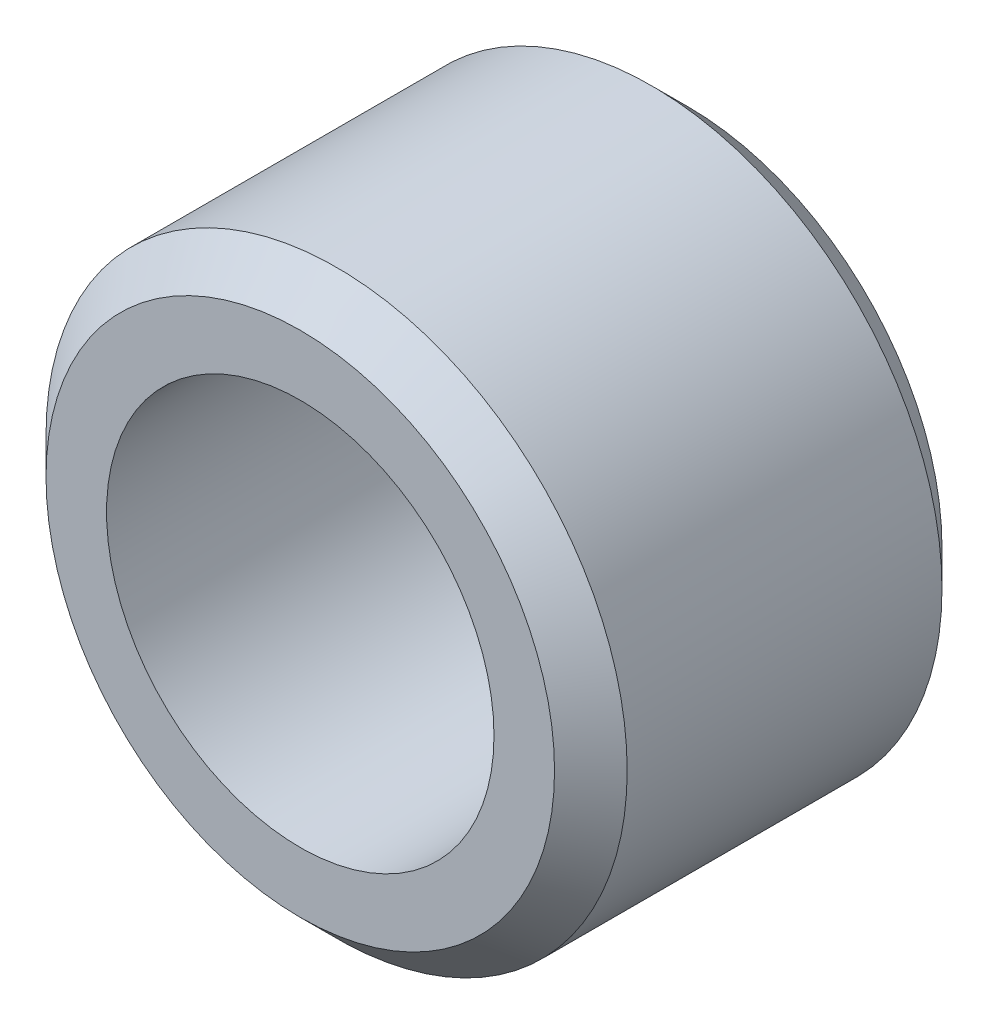
ISO-10303-21;
HEADER;
FILE_DESCRIPTION(('STEP AP214'),'2;1');
FILE_NAME('part.step','',(''),(''),'','','');
FILE_SCHEMA(('AUTOMOTIVE_DESIGN { 1 0 10303 214 1 1 1 1 }'));
ENDSEC;
DATA;
#1=APPLICATION_CONTEXT('core data for automotive mechanical design processes');
#2=APPLICATION_PROTOCOL_DEFINITION('international standard','automotive_design',2000,#1);
#3=PRODUCT_CONTEXT('',#1,'mechanical');
#4=PRODUCT('Part','Part','',(#3));
#5=PRODUCT_RELATED_PRODUCT_CATEGORY('part','',(#4));
#6=PRODUCT_DEFINITION_FORMATION('','',#4);
#7=PRODUCT_DEFINITION_CONTEXT('part definition',#1,'design');
#8=PRODUCT_DEFINITION('design','',#6,#7);
#9=PRODUCT_DEFINITION_SHAPE('','',#8);
#10=(LENGTH_UNIT() NAMED_UNIT(*) SI_UNIT(.MILLI.,.METRE.));
#11=(NAMED_UNIT(*) PLANE_ANGLE_UNIT() SI_UNIT($,.RADIAN.));
#12=(NAMED_UNIT(*) SI_UNIT($,.STERADIAN.) SOLID_ANGLE_UNIT());
#13=UNCERTAINTY_MEASURE_WITH_UNIT(LENGTH_MEASURE(1.E-05),#10,'distance_accuracy_value','');
#14=(GEOMETRIC_REPRESENTATION_CONTEXT(3) GLOBAL_UNCERTAINTY_ASSIGNED_CONTEXT((#13)) GLOBAL_UNIT_ASSIGNED_CONTEXT((#10,
#11,#12)) REPRESENTATION_CONTEXT('',''));
#15=CARTESIAN_POINT('',(0.,0.,0.));
#16=DIRECTION('',(0.,0.,1.));
#17=DIRECTION('',(1.,0.,0.));
#18=AXIS2_PLACEMENT_3D('',#15,#16,#17);
#19=CARTESIAN_POINT('',(0.,4.7625,3.175));
#20=DIRECTION('',(0.,0.,-1.));
#21=DIRECTION('',(-1.,0.,0.));
#22=AXIS2_PLACEMENT_3D('',#19,#20,#21);
#23=PLANE('',#22);
#24=CARTESIAN_POINT('',(0.,0.,3.175));
#25=DIRECTION('',(0.,0.,-1.));
#26=DIRECTION('',(-1.,0.,0.));
#27=AXIS2_PLACEMENT_3D('',#24,#25,#26);
#28=CIRCLE('',#27,4.1671875);
#29=CARTESIAN_POINT('',(-4.1671875,0.,3.175));
#30=VERTEX_POINT('',#29);
#31=EDGE_CURVE('E10',#30,#30,#28,.F.);
#32=ORIENTED_EDGE('',*,*,#31,.T.);
#33=EDGE_LOOP('',(#32));
#34=FACE_BOUND('',#33,.T.);
#35=CARTESIAN_POINT('',(0.,0.,3.175));
#36=DIRECTION('',(0.,0.,1.));
#37=DIRECTION('',(1.,0.,0.));
#38=AXIS2_PLACEMENT_3D('',#35,#36,#37);
#39=CIRCLE('',#38,3.175);
#40=CARTESIAN_POINT('',(3.175,0.,3.175));
#41=VERTEX_POINT('',#40);
#42=EDGE_CURVE('E52',#41,#41,#39,.T.);
#43=ORIENTED_EDGE('',*,*,#42,.F.);
#44=EDGE_LOOP('',(#43));
#45=FACE_BOUND('',#44,.T.);
#46=ADVANCED_FACE('F32',(#34,#45),#23,.F.);
#47=CARTESIAN_POINT('',(0.,0.,3.175));
#48=DIRECTION('',(0.,0.,1.));
#49=DIRECTION('',(1.,0.,0.));
#50=AXIS2_PLACEMENT_3D('',#47,#48,#49);
#51=CYLINDRICAL_SURFACE('',#50,3.175);
#52=CARTESIAN_POINT('',(0.,0.,-3.175));
#53=DIRECTION('',(0.,0.,1.));
#54=DIRECTION('',(1.,0.,0.));
#55=AXIS2_PLACEMENT_3D('',#52,#53,#54);
#56=CIRCLE('',#55,3.175);
#57=CARTESIAN_POINT('',(3.175,0.,-3.175));
#58=VERTEX_POINT('',#57);
#59=EDGE_CURVE('E55',#58,#58,#56,.T.);
#60=ORIENTED_EDGE('',*,*,#59,.F.);
#61=EDGE_LOOP('',(#60));
#62=FACE_BOUND('',#61,.T.);
#63=ORIENTED_EDGE('',*,*,#42,.T.);
#64=EDGE_LOOP('',(#63));
#65=FACE_BOUND('',#64,.T.);
#66=ADVANCED_FACE('F61',(#62,#65),#51,.F.);
#67=CARTESIAN_POINT('',(0.,3.175,-3.175));
#68=DIRECTION('',(0.,0.,1.));
#69=DIRECTION('',(1.,0.,0.));
#70=AXIS2_PLACEMENT_3D('',#67,#68,#69);
#71=PLANE('',#70);
#72=CARTESIAN_POINT('',(0.,0.,-3.175));
#73=DIRECTION('',(0.,0.,1.));
#74=DIRECTION('',(1.,0.,0.));
#75=AXIS2_PLACEMENT_3D('',#72,#73,#74);
#76=CIRCLE('',#75,4.1671875);
#77=CARTESIAN_POINT('',(4.1671875,0.,-3.175));
#78=VERTEX_POINT('',#77);
#79=EDGE_CURVE('E39',#78,#78,#76,.F.);
#80=ORIENTED_EDGE('',*,*,#79,.T.);
#81=EDGE_LOOP('',(#80));
#82=FACE_BOUND('',#81,.T.);
#83=ORIENTED_EDGE('',*,*,#59,.T.);
#84=EDGE_LOOP('',(#83));
#85=FACE_BOUND('',#84,.T.);
#86=ADVANCED_FACE('F59',(#82,#85),#71,.F.);
#87=CARTESIAN_POINT('',(0.,0.,3.175));
#88=DIRECTION('',(0.,0.,1.));
#89=DIRECTION('',(1.,0.,0.));
#90=AXIS2_PLACEMENT_3D('',#87,#88,#89);
#91=CYLINDRICAL_SURFACE('',#90,4.7625);
#92=CARTESIAN_POINT('',(0.,0.,-2.5796875));
#93=DIRECTION('',(0.,0.,1.));
#94=DIRECTION('',(1.,0.,0.));
#95=AXIS2_PLACEMENT_3D('',#92,#93,#94);
#96=CIRCLE('',#95,4.7625);
#97=CARTESIAN_POINT('',(4.7625,0.,-2.5796875));
#98=VERTEX_POINT('',#97);
#99=EDGE_CURVE('E43',#98,#98,#96,.T.);
#100=ORIENTED_EDGE('',*,*,#99,.T.);
#101=EDGE_LOOP('',(#100));
#102=FACE_BOUND('',#101,.T.);
#103=CARTESIAN_POINT('',(0.,0.,2.5796875));
#104=DIRECTION('',(0.,0.,-1.));
#105=DIRECTION('',(-1.,0.,0.));
#106=AXIS2_PLACEMENT_3D('',#103,#104,#105);
#107=CIRCLE('',#106,4.7625);
#108=CARTESIAN_POINT('',(-4.7625,0.,2.5796875));
#109=VERTEX_POINT('',#108);
#110=EDGE_CURVE('E47',#109,#109,#107,.T.);
#111=ORIENTED_EDGE('',*,*,#110,.T.);
#112=EDGE_LOOP('',(#111));
#113=FACE_BOUND('',#112,.T.);
#114=ADVANCED_FACE('F74',(#102,#113),#91,.T.);
#115=CARTESIAN_POINT('',(0.,0.,-2.5796875));
#116=DIRECTION('',(0.,0.,1.));
#117=DIRECTION('',(1.,0.,0.));
#118=AXIS2_PLACEMENT_3D('',#115,#116,#117);
#119=CONICAL_SURFACE('',#118,4.7625,0.78539816339745);
#120=ORIENTED_EDGE('',*,*,#79,.F.);
#121=EDGE_LOOP('',(#120));
#122=FACE_BOUND('',#121,.T.);
#123=ORIENTED_EDGE('',*,*,#99,.F.);
#124=EDGE_LOOP('',(#123));
#125=FACE_BOUND('',#124,.T.);
#126=ADVANCED_FACE('F72',(#122,#125),#119,.T.);
#127=CARTESIAN_POINT('',(0.,0.,3.175));
#128=DIRECTION('',(0.,0.,-1.));
#129=DIRECTION('',(-1.,0.,0.));
#130=AXIS2_PLACEMENT_3D('',#127,#128,#129);
#131=CONICAL_SURFACE('',#130,4.1671875,0.785398163397447);
#132=ORIENTED_EDGE('',*,*,#110,.F.);
#133=EDGE_LOOP('',(#132));
#134=FACE_BOUND('',#133,.T.);
#135=ORIENTED_EDGE('',*,*,#31,.F.);
#136=EDGE_LOOP('',(#135));
#137=FACE_BOUND('',#136,.T.);
#138=ADVANCED_FACE('F34',(#134,#137),#131,.T.);
#139=CLOSED_SHELL('',(#46,#66,#86,#114,#126,#138));
#140=MANIFOLD_SOLID_BREP('B2',#139);
#141=ADVANCED_BREP_SHAPE_REPRESENTATION('',(#18,#140),#14);
#142=SHAPE_DEFINITION_REPRESENTATION(#9,#141);
ENDSEC;
END-ISO-10303-21;
